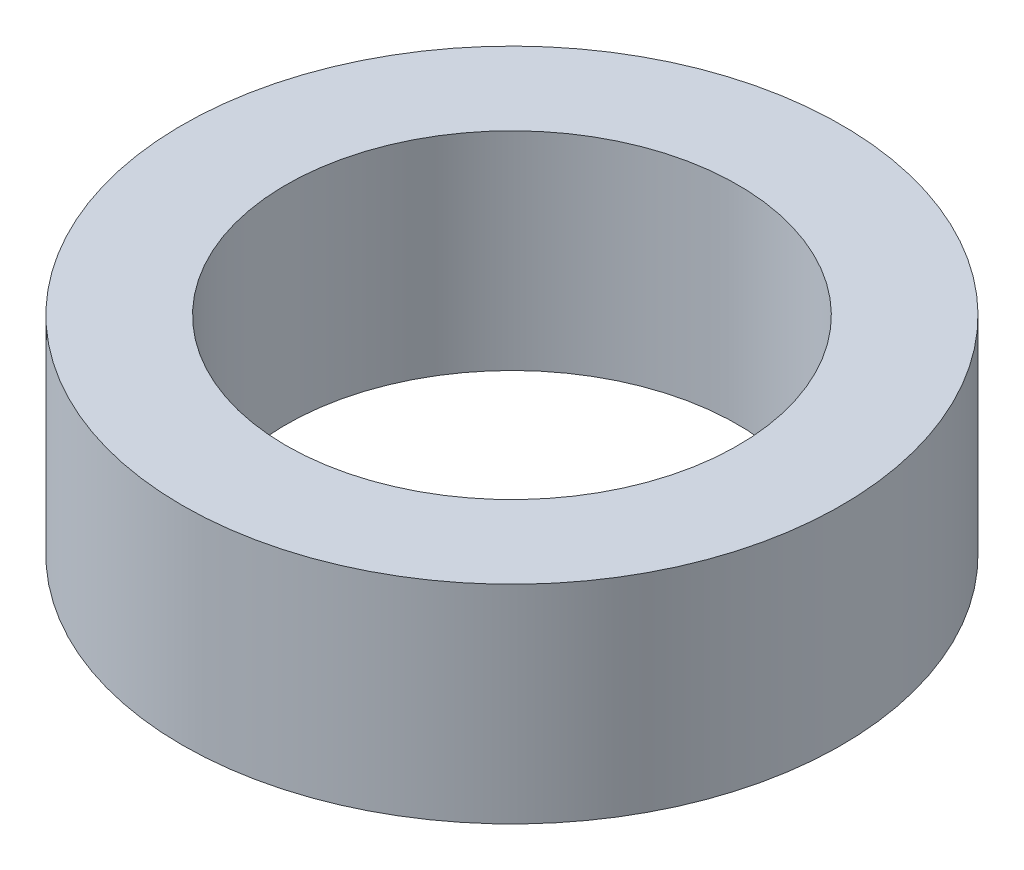
ISO-10303-21;
HEADER;
FILE_DESCRIPTION(('STEP AP214'),'2;1');
FILE_NAME('part.step','',(''),(''),'','','');
FILE_SCHEMA(('AUTOMOTIVE_DESIGN { 1 0 10303 214 1 1 1 1 }'));
ENDSEC;
DATA;
#1=APPLICATION_CONTEXT('core data for automotive mechanical design processes');
#2=APPLICATION_PROTOCOL_DEFINITION('international standard','automotive_design',2000,#1);
#3=PRODUCT_CONTEXT('',#1,'mechanical');
#4=PRODUCT('Part','Part','',(#3));
#5=PRODUCT_RELATED_PRODUCT_CATEGORY('part','',(#4));
#6=PRODUCT_DEFINITION_FORMATION('','',#4);
#7=PRODUCT_DEFINITION_CONTEXT('part definition',#1,'design');
#8=PRODUCT_DEFINITION('design','',#6,#7);
#9=PRODUCT_DEFINITION_SHAPE('','',#8);
#10=(LENGTH_UNIT() NAMED_UNIT(*) SI_UNIT(.MILLI.,.METRE.));
#11=(NAMED_UNIT(*) PLANE_ANGLE_UNIT() SI_UNIT($,.RADIAN.));
#12=(NAMED_UNIT(*) SI_UNIT($,.STERADIAN.) SOLID_ANGLE_UNIT());
#13=UNCERTAINTY_MEASURE_WITH_UNIT(LENGTH_MEASURE(1.E-05),#10,'distance_accuracy_value','');
#14=(GEOMETRIC_REPRESENTATION_CONTEXT(3) GLOBAL_UNCERTAINTY_ASSIGNED_CONTEXT((#13)) GLOBAL_UNIT_ASSIGNED_CONTEXT((#10,
#11,#12)) REPRESENTATION_CONTEXT('',''));
#15=CARTESIAN_POINT('',(0.,0.,0.));
#16=DIRECTION('',(0.,0.,1.));
#17=DIRECTION('',(1.,0.,0.));
#18=AXIS2_PLACEMENT_3D('',#15,#16,#17);
#19=CARTESIAN_POINT('',(0.,3.,0.));
#20=DIRECTION('',(0.,1.,0.));
#21=DIRECTION('',(0.,0.,1.));
#22=AXIS2_PLACEMENT_3D('',#19,#20,#21);
#23=PLANE('',#22);
#24=CARTESIAN_POINT('',(0.,3.,0.));
#25=DIRECTION('',(0.,1.,0.));
#26=DIRECTION('',(0.,0.,1.));
#27=AXIS2_PLACEMENT_3D('',#24,#25,#26);
#28=CIRCLE('',#27,4.7625);
#29=CARTESIAN_POINT('',(0.,3.,4.7625));
#30=VERTEX_POINT('',#29);
#31=EDGE_CURVE('E10',#30,#30,#28,.T.);
#32=ORIENTED_EDGE('',*,*,#31,.T.);
#33=EDGE_LOOP('',(#32));
#34=FACE_BOUND('',#33,.T.);
#35=CARTESIAN_POINT('',(0.,3.,0.));
#36=DIRECTION('',(0.,1.,0.));
#37=DIRECTION('',(0.,0.,1.));
#38=AXIS2_PLACEMENT_3D('',#35,#36,#37);
#39=CIRCLE('',#38,3.2639);
#40=CARTESIAN_POINT('',(0.,3.,3.2639));
#41=VERTEX_POINT('',#40);
#42=EDGE_CURVE('E50',#41,#41,#39,.T.);
#43=ORIENTED_EDGE('',*,*,#42,.F.);
#44=EDGE_LOOP('',(#43));
#45=FACE_BOUND('',#44,.T.);
#46=ADVANCED_FACE('F37',(#34,#45),#23,.T.);
#47=CARTESIAN_POINT('',(0.,0.,0.));
#48=DIRECTION('',(0.,1.,0.));
#49=DIRECTION('',(0.,0.,1.));
#50=AXIS2_PLACEMENT_3D('',#47,#48,#49);
#51=PLANE('',#50);
#52=CARTESIAN_POINT('',(0.,0.,0.));
#53=DIRECTION('',(0.,1.,0.));
#54=DIRECTION('',(0.,0.,1.));
#55=AXIS2_PLACEMENT_3D('',#52,#53,#54);
#56=CIRCLE('',#55,4.7625);
#57=CARTESIAN_POINT('',(0.,0.,4.7625));
#58=VERTEX_POINT('',#57);
#59=EDGE_CURVE('E41',#58,#58,#56,.T.);
#60=ORIENTED_EDGE('',*,*,#59,.F.);
#61=EDGE_LOOP('',(#60));
#62=FACE_BOUND('',#61,.T.);
#63=CARTESIAN_POINT('',(0.,0.,0.));
#64=DIRECTION('',(0.,1.,0.));
#65=DIRECTION('',(0.,0.,1.));
#66=AXIS2_PLACEMENT_3D('',#63,#64,#65);
#67=CIRCLE('',#66,3.2639);
#68=CARTESIAN_POINT('',(0.,0.,3.2639));
#69=VERTEX_POINT('',#68);
#70=EDGE_CURVE('E52',#69,#69,#67,.T.);
#71=ORIENTED_EDGE('',*,*,#70,.T.);
#72=EDGE_LOOP('',(#71));
#73=FACE_BOUND('',#72,.T.);
#74=ADVANCED_FACE('F64',(#62,#73),#51,.F.);
#75=CARTESIAN_POINT('',(0.,3.,0.));
#76=DIRECTION('',(0.,-1.,0.));
#77=DIRECTION('',(0.,0.,-1.));
#78=AXIS2_PLACEMENT_3D('',#75,#76,#77);
#79=CYLINDRICAL_SURFACE('',#78,4.7625);
#80=ORIENTED_EDGE('',*,*,#31,.F.);
#81=EDGE_LOOP('',(#80));
#82=FACE_BOUND('',#81,.T.);
#83=ORIENTED_EDGE('',*,*,#59,.T.);
#84=EDGE_LOOP('',(#83));
#85=FACE_BOUND('',#84,.T.);
#86=ADVANCED_FACE('F39',(#82,#85),#79,.T.);
#87=CARTESIAN_POINT('',(0.,3.,0.));
#88=DIRECTION('',(0.,-1.,0.));
#89=DIRECTION('',(0.,0.,-1.));
#90=AXIS2_PLACEMENT_3D('',#87,#88,#89);
#91=CYLINDRICAL_SURFACE('',#90,3.2639);
#92=ORIENTED_EDGE('',*,*,#42,.T.);
#93=EDGE_LOOP('',(#92));
#94=FACE_BOUND('',#93,.T.);
#95=ORIENTED_EDGE('',*,*,#70,.F.);
#96=EDGE_LOOP('',(#95));
#97=FACE_BOUND('',#96,.T.);
#98=ADVANCED_FACE('F60',(#94,#97),#91,.F.);
#99=CLOSED_SHELL('',(#46,#74,#86,#98));
#100=MANIFOLD_SOLID_BREP('B2',#99);
#101=ADVANCED_BREP_SHAPE_REPRESENTATION('',(#18,#100),#14);
#102=SHAPE_DEFINITION_REPRESENTATION(#9,#101);
ENDSEC;
END-ISO-10303-21;
